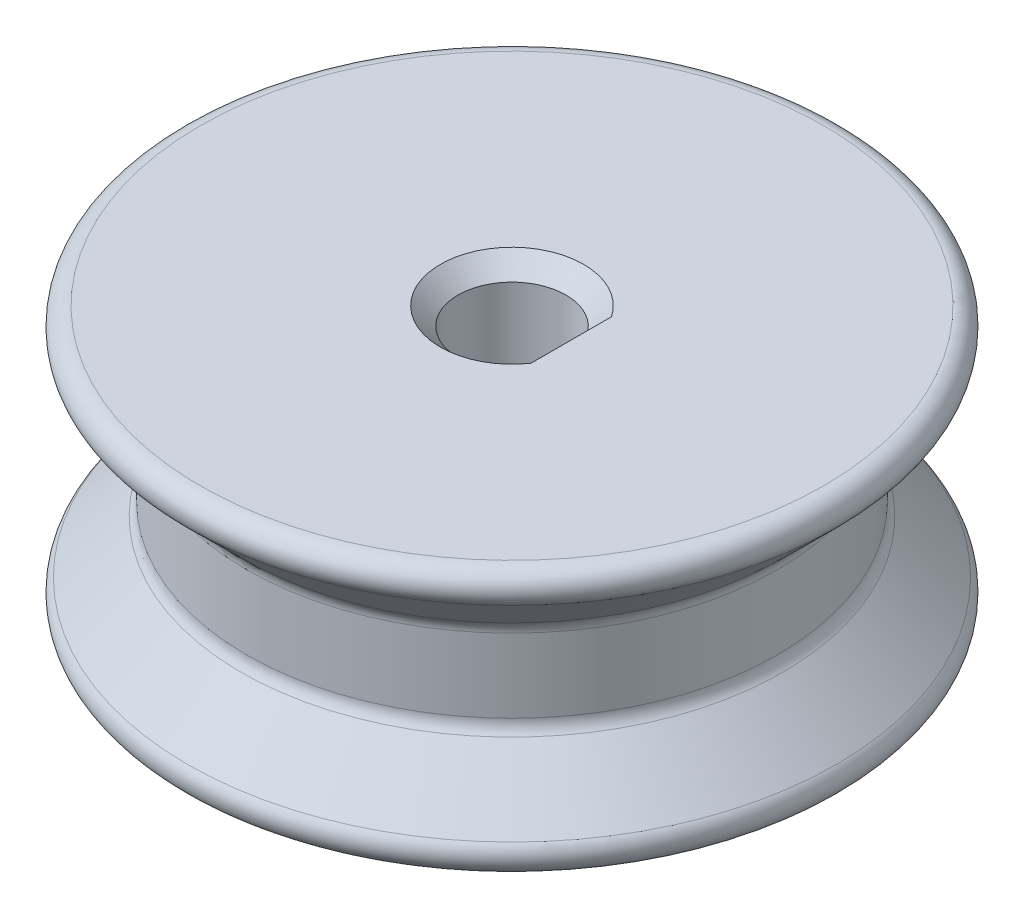
ISO-10303-21;
HEADER;
FILE_DESCRIPTION(('STEP AP214'),'2;1');
FILE_NAME('part.step','',(''),(''),'','','');
FILE_SCHEMA(('AUTOMOTIVE_DESIGN { 1 0 10303 214 1 1 1 1 }'));
ENDSEC;
DATA;
#1=APPLICATION_CONTEXT('core data for automotive mechanical design processes');
#2=APPLICATION_PROTOCOL_DEFINITION('international standard','automotive_design',2000,#1);
#3=PRODUCT_CONTEXT('',#1,'mechanical');
#4=PRODUCT('Part','Part','',(#3));
#5=PRODUCT_RELATED_PRODUCT_CATEGORY('part','',(#4));
#6=PRODUCT_DEFINITION_FORMATION('','',#4);
#7=PRODUCT_DEFINITION_CONTEXT('part definition',#1,'design');
#8=PRODUCT_DEFINITION('design','',#6,#7);
#9=PRODUCT_DEFINITION_SHAPE('','',#8);
#10=(LENGTH_UNIT() NAMED_UNIT(*) SI_UNIT(.MILLI.,.METRE.));
#11=(NAMED_UNIT(*) PLANE_ANGLE_UNIT() SI_UNIT($,.RADIAN.));
#12=(NAMED_UNIT(*) SI_UNIT($,.STERADIAN.) SOLID_ANGLE_UNIT());
#13=UNCERTAINTY_MEASURE_WITH_UNIT(LENGTH_MEASURE(1.E-05),#10,'distance_accuracy_value','');
#14=(GEOMETRIC_REPRESENTATION_CONTEXT(3) GLOBAL_UNCERTAINTY_ASSIGNED_CONTEXT((#13)) GLOBAL_UNIT_ASSIGNED_CONTEXT((#10,
#11,#12)) REPRESENTATION_CONTEXT('',''));
#15=CARTESIAN_POINT('',(0.,0.,0.));
#16=DIRECTION('',(0.,0.,1.));
#17=DIRECTION('',(1.,0.,0.));
#18=AXIS2_PLACEMENT_3D('',#15,#16,#17);
#19=CARTESIAN_POINT('',(14.568697780203,0.,0.));
#20=DIRECTION('',(0.,1.,0.));
#21=DIRECTION('',(-1.,0.,0.));
#22=AXIS2_PLACEMENT_3D('',#19,#20,#21);
#23=PLANE('',#22);
#24=CARTESIAN_POINT('',(-3.05,0.,0.));
#25=DIRECTION('',(0.,1.,0.));
#26=DIRECTION('',(-1.,0.,0.));
#27=AXIS2_PLACEMENT_3D('',#24,#25,#26);
#28=CIRCLE('',#27,17.618697780203);
#29=CARTESIAN_POINT('',(-20.668697780203,0.,0.));
#30=VERTEX_POINT('',#29);
#31=EDGE_CURVE('E89',#30,#30,#28,.T.);
#32=ORIENTED_EDGE('',*,*,#31,.F.);
#33=EDGE_LOOP('',(#32));
#34=FACE_BOUND('',#33,.T.);
#35=CARTESIAN_POINT('',(-3.05,0.,0.));
#36=DIRECTION('',(0.,1.,0.));
#37=DIRECTION('',(-1.,0.,0.));
#38=AXIS2_PLACEMENT_3D('',#35,#36,#37);
#39=CIRCLE('',#38,3.05);
#40=CARTESIAN_POINT('',(-6.1,0.,0.));
#41=VERTEX_POINT('',#40);
#42=EDGE_CURVE('E114',#41,#41,#39,.T.);
#43=ORIENTED_EDGE('',*,*,#42,.T.);
#44=EDGE_LOOP('',(#43));
#45=FACE_BOUND('',#44,.T.);
#46=ADVANCED_FACE('F33',(#34,#45),#23,.F.);
#47=CARTESIAN_POINT('',(-3.05,12.,0.));
#48=DIRECTION('',(0.,1.,0.));
#49=DIRECTION('',(-1.,0.,0.));
#50=AXIS2_PLACEMENT_3D('',#47,#48,#49);
#51=CYLINDRICAL_SURFACE('',#50,3.05);
#52=DIRECTION('',(0.,1.,0.));
#53=VECTOR('',#52,1.);
#54=CARTESIAN_POINT('',(-0.699999999999998,5.,-1.94422220952236));
#55=LINE('',#54,#53);
#56=CARTESIAN_POINT('',(-0.699999999999999,5.,-1.94422220952236));
#57=VERTEX_POINT('',#56);
#58=CARTESIAN_POINT('',(-0.699999999999999,14.,-1.94422220952236));
#59=VERTEX_POINT('',#58);
#60=EDGE_CURVE('E75',#57,#59,#55,.T.);
#61=ORIENTED_EDGE('',*,*,#60,.T.);
#62=CARTESIAN_POINT('',(-3.05,14.,0.));
#63=DIRECTION('',(0.,-1.,0.));
#64=DIRECTION('',(0.,0.,-1.));
#65=AXIS2_PLACEMENT_3D('',#62,#63,#64);
#66=CIRCLE('',#65,3.05);
#67=CARTESIAN_POINT('',(-0.699999999999999,14.,1.94422220952236));
#68=VERTEX_POINT('',#67);
#69=EDGE_CURVE('E11',#59,#68,#66,.F.);
#70=ORIENTED_EDGE('',*,*,#69,.T.);
#71=DIRECTION('',(0.,1.,0.));
#72=VECTOR('',#71,1.);
#73=CARTESIAN_POINT('',(-0.699999999999998,5.,1.94422220952236));
#74=LINE('',#73,#72);
#75=CARTESIAN_POINT('',(-0.699999999999999,5.,1.94422220952236));
#76=VERTEX_POINT('',#75);
#77=EDGE_CURVE('E76',#76,#68,#74,.T.);
#78=ORIENTED_EDGE('',*,*,#77,.F.);
#79=CARTESIAN_POINT('',(-3.05,5.,0.));
#80=DIRECTION('',(0.,1.,0.));
#81=DIRECTION('',(-1.,0.,0.));
#82=AXIS2_PLACEMENT_3D('',#79,#80,#81);
#83=CIRCLE('',#82,3.05);
#84=EDGE_CURVE('E71',#57,#76,#83,.F.);
#85=ORIENTED_EDGE('',*,*,#84,.F.);
#86=EDGE_LOOP('',(#61,#70,#78,#85));
#87=FACE_BOUND('',#86,.T.);
#88=ORIENTED_EDGE('',*,*,#42,.F.);
#89=EDGE_LOOP('',(#88));
#90=FACE_BOUND('',#89,.T.);
#91=ADVANCED_FACE('F73',(#87,#90),#51,.F.);
#92=CARTESIAN_POINT('',(0.,15.,0.));
#93=DIRECTION('',(0.,-1.,0.));
#94=DIRECTION('',(1.,0.,0.));
#95=AXIS2_PLACEMENT_3D('',#92,#93,#94);
#96=PLANE('',#95);
#97=CARTESIAN_POINT('',(-3.05,15.,0.));
#98=DIRECTION('',(0.,-1.,0.));
#99=DIRECTION('',(1.,0.,0.));
#100=AXIS2_PLACEMENT_3D('',#97,#98,#99);
#101=CIRCLE('',#100,4.05);
#102=CARTESIAN_POINT('',(0.3,15.,2.27596133534821));
#103=VERTEX_POINT('',#102);
#104=CARTESIAN_POINT('',(0.3,15.,-2.27596133534821));
#105=VERTEX_POINT('',#104);
#106=EDGE_CURVE('E117',#103,#105,#101,.T.);
#107=ORIENTED_EDGE('',*,*,#106,.T.);
#108=DIRECTION('',(0.,0.,1.));
#109=VECTOR('',#108,1.);
#110=CARTESIAN_POINT('',(0.3,15.,1.94422220952236));
#111=LINE('',#110,#109);
#112=EDGE_CURVE('E119',#105,#103,#111,.T.);
#113=ORIENTED_EDGE('',*,*,#112,.T.);
#114=EDGE_LOOP('',(#107,#113));
#115=FACE_BOUND('',#114,.T.);
#116=CARTESIAN_POINT('',(-3.05,15.,0.));
#117=DIRECTION('',(0.,1.,0.));
#118=DIRECTION('',(-1.,0.,0.));
#119=AXIS2_PLACEMENT_3D('',#116,#117,#118);
#120=CIRCLE('',#119,17.618697780203);
#121=CARTESIAN_POINT('',(-20.668697780203,15.,0.));
#122=VERTEX_POINT('',#121);
#123=EDGE_CURVE('E111',#122,#122,#120,.T.);
#124=ORIENTED_EDGE('',*,*,#123,.T.);
#125=EDGE_LOOP('',(#124));
#126=FACE_BOUND('',#125,.T.);
#127=ADVANCED_FACE('F136',(#115,#126),#96,.F.);
#128=CARTESIAN_POINT('',(-3.05,14.,0.));
#129=DIRECTION('',(0.,1.,0.));
#130=DIRECTION('',(-1.,0.,0.));
#131=AXIS2_PLACEMENT_3D('',#128,#129,#130);
#132=TOROIDAL_SURFACE('',#131,17.618697780203,1.);
#133=ORIENTED_EDGE('',*,*,#123,.F.);
#134=EDGE_LOOP('',(#133));
#135=FACE_BOUND('',#134,.T.);
#136=CARTESIAN_POINT('',(-3.05,13.289384069108,0.));
#137=DIRECTION('',(0.,1.,0.));
#138=DIRECTION('',(-1.,0.,0.));
#139=AXIS2_PLACEMENT_3D('',#136,#137,#138);
#140=CIRCLE('',#139,18.322277909799);
#141=CARTESIAN_POINT('',(-21.372277909799,13.2893840691079,0.));
#142=VERTEX_POINT('',#141);
#143=EDGE_CURVE('E108',#142,#142,#140,.T.);
#144=ORIENTED_EDGE('',*,*,#143,.T.);
#145=EDGE_LOOP('',(#144));
#146=FACE_BOUND('',#145,.T.);
#147=ADVANCED_FACE('F139',(#135,#146),#132,.T.);
#148=CARTESIAN_POINT('',(-3.05,10.2934850202019,0.));
#149=DIRECTION('',(0.,1.,0.));
#150=DIRECTION('',(-1.,0.,0.));
#151=AXIS2_PLACEMENT_3D('',#148,#149,#150);
#152=CONICAL_SURFACE('',#151,15.2964198704039,0.790373246728304);
#153=ORIENTED_EDGE('',*,*,#143,.F.);
#154=EDGE_LOOP('',(#153));
#155=FACE_BOUND('',#154,.T.);
#156=CARTESIAN_POINT('',(-3.05,10.2934850202019,0.));
#157=DIRECTION('',(0.,1.,0.));
#158=DIRECTION('',(-1.,0.,0.));
#159=AXIS2_PLACEMENT_3D('',#156,#157,#158);
#160=CIRCLE('',#159,15.2964198704039);
#161=CARTESIAN_POINT('',(-18.3464198704039,10.2934850202019,0.));
#162=VERTEX_POINT('',#161);
#163=EDGE_CURVE('E105',#162,#162,#160,.T.);
#164=ORIENTED_EDGE('',*,*,#163,.T.);
#165=EDGE_LOOP('',(#164));
#166=FACE_BOUND('',#165,.T.);
#167=ADVANCED_FACE('F143',(#155,#166),#152,.T.);
#168=CARTESIAN_POINT('',(-3.05,9.58286908930986,0.));
#169=DIRECTION('',(0.,1.,0.));
#170=DIRECTION('',(-1.,0.,0.));
#171=AXIS2_PLACEMENT_3D('',#168,#169,#170);
#172=TOROIDAL_SURFACE('',#171,16.,1.);
#173=ORIENTED_EDGE('',*,*,#163,.F.);
#174=EDGE_LOOP('',(#173));
#175=FACE_BOUND('',#174,.T.);
#176=CARTESIAN_POINT('',(-3.05,9.58286908930986,0.));
#177=DIRECTION('',(0.,1.,0.));
#178=DIRECTION('',(-1.,0.,0.));
#179=AXIS2_PLACEMENT_3D('',#176,#177,#178);
#180=CIRCLE('',#179,15.);
#181=CARTESIAN_POINT('',(-18.05,9.58286908930986,0.));
#182=VERTEX_POINT('',#181);
#183=EDGE_CURVE('E102',#182,#182,#180,.T.);
#184=ORIENTED_EDGE('',*,*,#183,.T.);
#185=EDGE_LOOP('',(#184));
#186=FACE_BOUND('',#185,.T.);
#187=ADVANCED_FACE('F147',(#175,#186),#172,.F.);
#188=CARTESIAN_POINT('',(-3.05,12.,0.));
#189=DIRECTION('',(0.,1.,0.));
#190=DIRECTION('',(-1.,0.,0.));
#191=AXIS2_PLACEMENT_3D('',#188,#189,#190);
#192=CYLINDRICAL_SURFACE('',#191,15.);
#193=ORIENTED_EDGE('',*,*,#183,.F.);
#194=EDGE_LOOP('',(#193));
#195=FACE_BOUND('',#194,.T.);
#196=CARTESIAN_POINT('',(-3.05,5.41713091069014,0.));
#197=DIRECTION('',(0.,1.,0.));
#198=DIRECTION('',(-1.,0.,0.));
#199=AXIS2_PLACEMENT_3D('',#196,#197,#198);
#200=CIRCLE('',#199,15.);
#201=CARTESIAN_POINT('',(-18.05,5.41713091069014,0.));
#202=VERTEX_POINT('',#201);
#203=EDGE_CURVE('E99',#202,#202,#200,.T.);
#204=ORIENTED_EDGE('',*,*,#203,.T.);
#205=EDGE_LOOP('',(#204));
#206=FACE_BOUND('',#205,.T.);
#207=ADVANCED_FACE('F151',(#195,#206),#192,.T.);
#208=CARTESIAN_POINT('',(-3.05,5.41713091069014,0.));
#209=DIRECTION('',(0.,1.,0.));
#210=DIRECTION('',(-1.,0.,0.));
#211=AXIS2_PLACEMENT_3D('',#208,#209,#210);
#212=TOROIDAL_SURFACE('',#211,16.,0.999999999999999);
#213=ORIENTED_EDGE('',*,*,#203,.F.);
#214=EDGE_LOOP('',(#213));
#215=FACE_BOUND('',#214,.T.);
#216=CARTESIAN_POINT('',(-3.05,4.7065149797981,0.));
#217=DIRECTION('',(0.,1.,0.));
#218=DIRECTION('',(-1.,0.,0.));
#219=AXIS2_PLACEMENT_3D('',#216,#217,#218);
#220=CIRCLE('',#219,15.2964198704039);
#221=CARTESIAN_POINT('',(-18.3464198704039,4.70651497979809,0.));
#222=VERTEX_POINT('',#221);
#223=EDGE_CURVE('E96',#222,#222,#220,.T.);
#224=ORIENTED_EDGE('',*,*,#223,.T.);
#225=EDGE_LOOP('',(#224));
#226=FACE_BOUND('',#225,.T.);
#227=ADVANCED_FACE('F155',(#215,#226),#212,.F.);
#228=CARTESIAN_POINT('',(-3.05,1.71061593089204,0.));
#229=DIRECTION('',(0.,-1.,0.));
#230=DIRECTION('',(1.,0.,0.));
#231=AXIS2_PLACEMENT_3D('',#228,#229,#230);
#232=CONICAL_SURFACE('',#231,18.322277909799,0.790373246728302);
#233=ORIENTED_EDGE('',*,*,#223,.F.);
#234=EDGE_LOOP('',(#233));
#235=FACE_BOUND('',#234,.T.);
#236=CARTESIAN_POINT('',(-3.05,1.71061593089204,0.));
#237=DIRECTION('',(0.,1.,0.));
#238=DIRECTION('',(-1.,0.,0.));
#239=AXIS2_PLACEMENT_3D('',#236,#237,#238);
#240=CIRCLE('',#239,18.322277909799);
#241=CARTESIAN_POINT('',(-21.372277909799,1.71061593089203,0.));
#242=VERTEX_POINT('',#241);
#243=EDGE_CURVE('E93',#242,#242,#240,.T.);
#244=ORIENTED_EDGE('',*,*,#243,.T.);
#245=EDGE_LOOP('',(#244));
#246=FACE_BOUND('',#245,.T.);
#247=ADVANCED_FACE('F159',(#235,#246),#232,.T.);
#248=CARTESIAN_POINT('',(-3.05,0.999999999999998,0.));
#249=DIRECTION('',(0.,1.,0.));
#250=DIRECTION('',(-1.,0.,0.));
#251=AXIS2_PLACEMENT_3D('',#248,#249,#250);
#252=TOROIDAL_SURFACE('',#251,17.618697780203,1.);
#253=ORIENTED_EDGE('',*,*,#243,.F.);
#254=EDGE_LOOP('',(#253));
#255=FACE_BOUND('',#254,.T.);
#256=ORIENTED_EDGE('',*,*,#31,.T.);
#257=EDGE_LOOP('',(#256));
#258=FACE_BOUND('',#257,.T.);
#259=ADVANCED_FACE('F163',(#255,#258),#252,.T.);
#260=CARTESIAN_POINT('',(-0.699999999999998,5.,0.));
#261=DIRECTION('',(-1.,0.,0.));
#262=DIRECTION('',(0.,-1.,0.));
#263=AXIS2_PLACEMENT_3D('',#260,#261,#262);
#264=PLANE('',#263);
#265=ORIENTED_EDGE('',*,*,#77,.T.);
#266=DIRECTION('',(0.,0.,-1.));
#267=VECTOR('',#266,1.);
#268=CARTESIAN_POINT('',(-0.699999999999999,14.,-1.94422220952236));
#269=LINE('',#268,#267);
#270=EDGE_CURVE('E46',#68,#59,#269,.T.);
#271=ORIENTED_EDGE('',*,*,#270,.T.);
#272=ORIENTED_EDGE('',*,*,#60,.F.);
#273=DIRECTION('',(0.,0.,1.));
#274=VECTOR('',#273,1.);
#275=CARTESIAN_POINT('',(-0.699999999999998,5.,0.));
#276=LINE('',#275,#274);
#277=EDGE_CURVE('E80',#57,#76,#276,.T.);
#278=ORIENTED_EDGE('',*,*,#277,.T.);
#279=EDGE_LOOP('',(#265,#271,#272,#278));
#280=FACE_BOUND('',#279,.T.);
#281=ADVANCED_FACE('F84',(#280),#264,.T.);
#282=CARTESIAN_POINT('',(0.,5.,0.));
#283=DIRECTION('',(0.,1.,0.));
#284=DIRECTION('',(-1.,0.,0.));
#285=AXIS2_PLACEMENT_3D('',#282,#283,#284);
#286=PLANE('',#285);
#287=ORIENTED_EDGE('',*,*,#84,.T.);
#288=ORIENTED_EDGE('',*,*,#277,.F.);
#289=EDGE_LOOP('',(#287,#288));
#290=FACE_BOUND('',#289,.T.);
#291=ADVANCED_FACE('F86',(#290),#286,.F.);
#292=CARTESIAN_POINT('',(-3.05,14.,0.));
#293=DIRECTION('',(0.,1.,0.));
#294=DIRECTION('',(0.,0.,1.));
#295=AXIS2_PLACEMENT_3D('',#292,#293,#294);
#296=CONICAL_SURFACE('',#295,3.05,0.785398163397447);
#297=CARTESIAN_POINT('',(0.3,15.,2.27596133534821));
#298=CARTESIAN_POINT('',(0.216354128806231,14.9163541288062,2.25023234932487));
#299=CARTESIAN_POINT('',(0.132771014301008,14.832771014301,2.22409175871115));
#300=CARTESIAN_POINT('',(-0.0342421036024926,14.6657578963975,2.17089185326292));
#301=CARTESIAN_POINT('',(-0.1176721181905,14.5823278818095,2.14383260863946));
#302=CARTESIAN_POINT('',(-0.28436634686504,14.415633653135,2.08869527644801));
#303=CARTESIAN_POINT('',(-0.367630556629842,14.3323694433702,2.06061716268039));
#304=CARTESIAN_POINT('',(-0.533967733003726,14.1660322669963,2.00331255967829));
#305=CARTESIAN_POINT('',(-0.617040684521978,14.082959315478,1.97408598290633));
#306=CARTESIAN_POINT('',(-0.7,14.,1.94422220952236));
#307=B_SPLINE_CURVE_WITH_KNOTS('',3,(#297,#298,#299,#300,#301,#302,#303,#304,#305,#306),
.UNSPECIFIED.,.F.,.F.,(4,2,2,2,4),(0.,0.363176880324798,0.726326065913831,1.08948459629425,
1.45267086102693),.UNSPECIFIED.);
#308=EDGE_CURVE('E122',#68,#103,#307,.F.);
#309=ORIENTED_EDGE('',*,*,#308,.F.);
#310=ORIENTED_EDGE('',*,*,#69,.F.);
#311=CARTESIAN_POINT('',(-0.699999999999999,14.,-1.94422220952236));
#312=CARTESIAN_POINT('',(-0.617040684521977,14.082959315478,-1.97408598290633));
#313=CARTESIAN_POINT('',(-0.533967733003726,14.1660322669963,-2.00331255967829));
#314=CARTESIAN_POINT('',(-0.367630556629841,14.3323694433702,-2.06061716268039));
#315=CARTESIAN_POINT('',(-0.28436634686504,14.415633653135,-2.08869527644801));
#316=CARTESIAN_POINT('',(-0.1176721181905,14.5823278818095,-2.14383260863946));
#317=CARTESIAN_POINT('',(-0.0342421036024925,14.6657578963975,-2.17089185326292));
#318=CARTESIAN_POINT('',(0.132771014301008,14.832771014301,-2.22409175871115));
#319=CARTESIAN_POINT('',(0.216354128806231,14.9163541288062,-2.25023234932487));
#320=CARTESIAN_POINT('',(0.299999999999999,15.,-2.27596133534821));
#321=B_SPLINE_CURVE_WITH_KNOTS('',3,(#311,#312,#313,#314,#315,#316,#317,#318,#319,#320),
.UNSPECIFIED.,.F.,.F.,(4,2,2,2,4),(0.,0.363186264732676,0.726344795113099,1.08949398070213,
1.45267086102693),.UNSPECIFIED.);
#322=EDGE_CURVE('E38',#105,#59,#321,.F.);
#323=ORIENTED_EDGE('',*,*,#322,.F.);
#324=ORIENTED_EDGE('',*,*,#106,.F.);
#325=EDGE_LOOP('',(#309,#310,#323,#324));
#326=FACE_BOUND('',#325,.T.);
#327=ADVANCED_FACE('F35',(#326),#296,.F.);
#328=CARTESIAN_POINT('',(0.3,15.,0.));
#329=DIRECTION('',(-0.707106781186549,0.707106781186546,0.));
#330=DIRECTION('',(0.,0.,-1.));
#331=AXIS2_PLACEMENT_3D('',#328,#329,#330);
#332=PLANE('',#331);
#333=ORIENTED_EDGE('',*,*,#322,.T.);
#334=ORIENTED_EDGE('',*,*,#270,.F.);
#335=ORIENTED_EDGE('',*,*,#308,.T.);
#336=ORIENTED_EDGE('',*,*,#112,.F.);
#337=EDGE_LOOP('',(#333,#334,#335,#336));
#338=FACE_BOUND('',#337,.T.);
#339=ADVANCED_FACE('F126',(#338),#332,.T.);
#340=CLOSED_SHELL('',(#46,#91,#127,#147,#167,#187,#207,#227,#247,#259,#281,#291,#327,#339));
#341=MANIFOLD_SOLID_BREP('B2',#340);
#342=ADVANCED_BREP_SHAPE_REPRESENTATION('',(#18,#341),#14);
#343=SHAPE_DEFINITION_REPRESENTATION(#9,#342);
ENDSEC;
END-ISO-10303-21;
